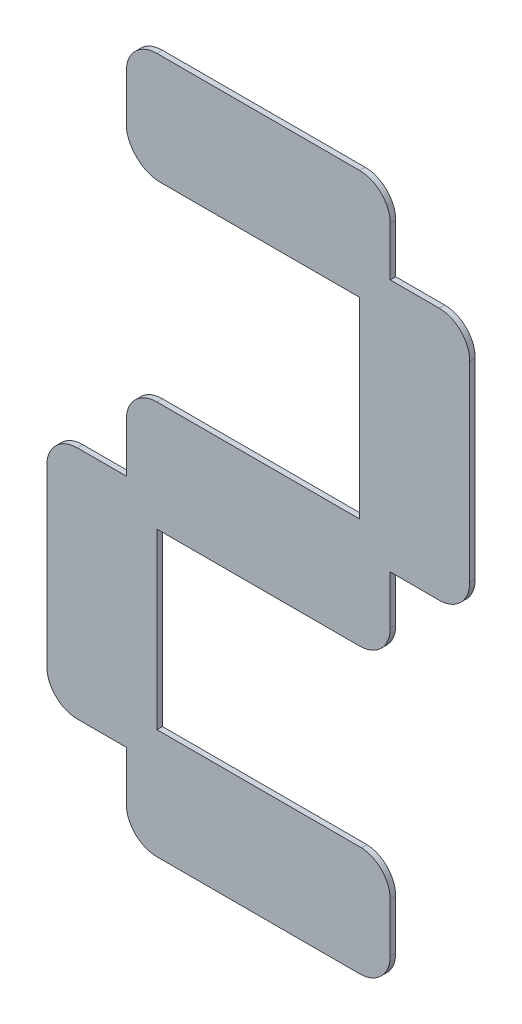
ISO-10303-21;
HEADER;
FILE_DESCRIPTION(('STEP AP214'),'2;1');
FILE_NAME('part.step','',(''),(''),'','','');
FILE_SCHEMA(('AUTOMOTIVE_DESIGN { 1 0 10303 214 1 1 1 1 }'));
ENDSEC;
DATA;
#1=APPLICATION_CONTEXT('core data for automotive mechanical design processes');
#2=APPLICATION_PROTOCOL_DEFINITION('international standard','automotive_design',2000,#1);
#3=PRODUCT_CONTEXT('',#1,'mechanical');
#4=PRODUCT('Part','Part','',(#3));
#5=PRODUCT_RELATED_PRODUCT_CATEGORY('part','',(#4));
#6=PRODUCT_DEFINITION_FORMATION('','',#4);
#7=PRODUCT_DEFINITION_CONTEXT('part definition',#1,'design');
#8=PRODUCT_DEFINITION('design','',#6,#7);
#9=PRODUCT_DEFINITION_SHAPE('','',#8);
#10=(LENGTH_UNIT() NAMED_UNIT(*) SI_UNIT(.MILLI.,.METRE.));
#11=(NAMED_UNIT(*) PLANE_ANGLE_UNIT() SI_UNIT($,.RADIAN.));
#12=(NAMED_UNIT(*) SI_UNIT($,.STERADIAN.) SOLID_ANGLE_UNIT());
#13=UNCERTAINTY_MEASURE_WITH_UNIT(LENGTH_MEASURE(1.E-05),#10,'distance_accuracy_value','');
#14=(GEOMETRIC_REPRESENTATION_CONTEXT(3) GLOBAL_UNCERTAINTY_ASSIGNED_CONTEXT((#13)) GLOBAL_UNIT_ASSIGNED_CONTEXT((#10,
#11,#12)) REPRESENTATION_CONTEXT('',''));
#15=CARTESIAN_POINT('',(0.,0.,0.));
#16=DIRECTION('',(0.,0.,1.));
#17=DIRECTION('',(1.,0.,0.));
#18=AXIS2_PLACEMENT_3D('',#15,#16,#17);
#19=CARTESIAN_POINT('',(8.329409215099,-32.65418459768,0.01));
#20=DIRECTION('',(0.,0.,1.));
#21=DIRECTION('',(1.,0.,0.));
#22=AXIS2_PLACEMENT_3D('',#19,#20,#21);
#23=PLANE('',#22);
#24=CARTESIAN_POINT('',(8.653180193375,-32.22062773011,0.01));
#25=DIRECTION('',(0.,0.,1.));
#26=DIRECTION('',(1.,0.,0.));
#27=AXIS2_PLACEMENT_3D('',#24,#25,#26);
#28=CIRCLE('',#27,0.05530104210836);
#29=CARTESIAN_POINT('',(8.708481235483,-32.22062773011,0.01));
#30=VERTEX_POINT('',#29);
#31=CARTESIAN_POINT('',(8.653180193375,-32.16532668801,0.01));
#32=VERTEX_POINT('',#31);
#33=EDGE_CURVE('E174',#30,#32,#28,.T.);
#34=ORIENTED_EDGE('',*,*,#33,.T.);
#35=DIRECTION('',(1.,0.,0.));
#36=VECTOR('',#35,1.);
#37=CARTESIAN_POINT('',(8.564607569204,-32.16532668801,0.01));
#38=LINE('',#37,#36);
#39=CARTESIAN_POINT('',(8.564607569204,-32.16532668801,0.01));
#40=VERTEX_POINT('',#39);
#41=EDGE_CURVE('E196',#40,#32,#38,.T.);
#42=ORIENTED_EDGE('',*,*,#41,.F.);
#43=DIRECTION('',(0.,-1.,0.));
#44=VECTOR('',#43,1.);
#45=CARTESIAN_POINT('',(8.564607569204,-32.07675406384,0.01));
#46=LINE('',#45,#44);
#47=CARTESIAN_POINT('',(8.564607569204,-32.07675406384,0.01));
#48=VERTEX_POINT('',#47);
#49=EDGE_CURVE('E235',#48,#40,#46,.T.);
#50=ORIENTED_EDGE('',*,*,#49,.F.);
#51=CARTESIAN_POINT('',(8.509306527096,-32.07675406384,0.01));
#52=DIRECTION('',(0.,0.,1.));
#53=DIRECTION('',(1.,0.,0.));
#54=AXIS2_PLACEMENT_3D('',#51,#52,#53);
#55=CIRCLE('',#54,0.05530104210836);
#56=CARTESIAN_POINT('',(8.509306527096,-32.02145302173,0.01));
#57=VERTEX_POINT('',#56);
#58=EDGE_CURVE('E242',#48,#57,#55,.T.);
#59=ORIENTED_EDGE('',*,*,#58,.T.);
#60=DIRECTION('',(1.,0.,0.));
#61=VECTOR('',#60,1.);
#62=CARTESIAN_POINT('',(8.142401846551,-32.02145302173,0.01));
#63=LINE('',#62,#61);
#64=CARTESIAN_POINT('',(8.142401846551,-32.02145302173,0.01));
#65=VERTEX_POINT('',#64);
#66=EDGE_CURVE('E267',#65,#57,#63,.T.);
#67=ORIENTED_EDGE('',*,*,#66,.F.);
#68=CARTESIAN_POINT('',(8.142401846551,-32.07675406384,0.01));
#69=DIRECTION('',(0.,0.,1.));
#70=DIRECTION('',(1.,0.,0.));
#71=AXIS2_PLACEMENT_3D('',#68,#69,#70);
#72=CIRCLE('',#71,0.05530104210836);
#73=CARTESIAN_POINT('',(8.087100804442,-32.07675406384,0.01));
#74=VERTEX_POINT('',#73);
#75=EDGE_CURVE('E280',#65,#74,#72,.T.);
#76=ORIENTED_EDGE('',*,*,#75,.T.);
#77=DIRECTION('',(0.,1.,0.));
#78=VECTOR('',#77,1.);
#79=CARTESIAN_POINT('',(8.087100804442,-32.16532668801,0.01));
#80=LINE('',#79,#78);
#81=CARTESIAN_POINT('',(8.087100804442,-32.16532668801,0.01));
#82=VERTEX_POINT('',#81);
#83=EDGE_CURVE('E164',#82,#74,#80,.T.);
#84=ORIENTED_EDGE('',*,*,#83,.F.);
#85=CARTESIAN_POINT('',(8.150242664368,-32.15698872512,0.01));
#86=DIRECTION('',(0.,0.,1.));
#87=DIRECTION('',(1.,0.,0.));
#88=AXIS2_PLACEMENT_3D('',#85,#86,#87);
#89=CIRCLE('',#88,0.06369);
#90=CARTESIAN_POINT('',(8.144195081973,-32.22039095574,0.01));
#91=VERTEX_POINT('',#90);
#92=EDGE_CURVE('E305',#82,#91,#89,.T.);
#93=ORIENTED_EDGE('',*,*,#92,.T.);
#94=DIRECTION('',(-1.,0.,0.));
#95=VECTOR('',#94,1.);
#96=CARTESIAN_POINT('',(8.509306527096,-32.22039095574,0.01));
#97=LINE('',#96,#95);
#98=CARTESIAN_POINT('',(8.509306527096,-32.22039095574,0.01));
#99=VERTEX_POINT('',#98);
#100=EDGE_CURVE('E312',#99,#91,#97,.T.);
#101=ORIENTED_EDGE('',*,*,#100,.F.);
#102=DIRECTION('',(0.,1.,0.));
#103=VECTOR('',#102,1.);
#104=CARTESIAN_POINT('',(8.509306527096,-32.567618,0.01));
#105=LINE('',#104,#103);
#106=CARTESIAN_POINT('',(8.509306527096,-32.567618,0.01));
#107=VERTEX_POINT('',#106);
#108=EDGE_CURVE('E159',#107,#99,#105,.T.);
#109=ORIENTED_EDGE('',*,*,#108,.F.);
#110=DIRECTION('',(1.,0.,0.));
#111=VECTOR('',#110,1.);
#112=CARTESIAN_POINT('',(8.142401846551,-32.567618,0.01));
#113=LINE('',#112,#111);
#114=CARTESIAN_POINT('',(8.142401846551,-32.567618,0.01));
#115=VERTEX_POINT('',#114);
#116=EDGE_CURVE('E157',#115,#107,#113,.T.);
#117=ORIENTED_EDGE('',*,*,#116,.F.);
#118=CARTESIAN_POINT('',(8.142401845466,-32.622919,0.01));
#119=DIRECTION('',(0.,0.,1.));
#120=DIRECTION('',(1.,0.,0.));
#121=AXIS2_PLACEMENT_3D('',#118,#119,#120);
#122=CIRCLE('',#121,0.055301);
#123=CARTESIAN_POINT('',(8.087100845466,-32.622919,0.01));
#124=VERTEX_POINT('',#123);
#125=EDGE_CURVE('E334',#115,#124,#122,.T.);
#126=ORIENTED_EDGE('',*,*,#125,.T.);
#127=DIRECTION('',(0.,1.,0.));
#128=VECTOR('',#127,1.);
#129=CARTESIAN_POINT('',(8.087100845466,-32.71149166627,0.01));
#130=LINE('',#129,#128);
#131=CARTESIAN_POINT('',(8.087100845466,-32.71149166627,0.01));
#132=VERTEX_POINT('',#131);
#133=EDGE_CURVE('E362',#132,#124,#130,.T.);
#134=ORIENTED_EDGE('',*,*,#133,.F.);
#135=DIRECTION('',(1.,0.,0.));
#136=VECTOR('',#135,1.);
#137=CARTESIAN_POINT('',(7.998528180273,-32.71149166627,0.01));
#138=LINE('',#137,#136);
#139=CARTESIAN_POINT('',(7.998528180273,-32.71149166627,0.01));
#140=VERTEX_POINT('',#139);
#141=EDGE_CURVE('E258',#140,#132,#138,.T.);
#142=ORIENTED_EDGE('',*,*,#141,.F.);
#143=CARTESIAN_POINT('',(7.998528180273,-32.76679270838,0.01));
#144=DIRECTION('',(0.,0.,1.));
#145=DIRECTION('',(1.,0.,0.));
#146=AXIS2_PLACEMENT_3D('',#143,#144,#145);
#147=CIRCLE('',#146,0.05530104210836);
#148=CARTESIAN_POINT('',(7.943227138164,-32.76679270838,0.01));
#149=VERTEX_POINT('',#148);
#150=EDGE_CURVE('E183',#140,#149,#147,.T.);
#151=ORIENTED_EDGE('',*,*,#150,.T.);
#152=DIRECTION('',(0.,1.,0.));
#153=VECTOR('',#152,1.);
#154=CARTESIAN_POINT('',(7.943227138164,-33.08113472498,0.01));
#155=LINE('',#154,#153);
#156=CARTESIAN_POINT('',(7.943227138164,-33.08113472498,0.01));
#157=VERTEX_POINT('',#156);
#158=EDGE_CURVE('E182',#157,#149,#155,.T.);
#159=ORIENTED_EDGE('',*,*,#158,.F.);
#160=CARTESIAN_POINT('',(7.998528180272,-33.08113472498,0.01));
#161=DIRECTION('',(0.,0.,1.));
#162=DIRECTION('',(1.,0.,0.));
#163=AXIS2_PLACEMENT_3D('',#160,#161,#162);
#164=CIRCLE('',#163,0.05530104210772);
#165=CARTESIAN_POINT('',(7.998528180272,-33.13643576709,0.01));
#166=VERTEX_POINT('',#165);
#167=EDGE_CURVE('E253',#157,#166,#164,.T.);
#168=ORIENTED_EDGE('',*,*,#167,.T.);
#169=DIRECTION('',(-1.,0.,0.));
#170=VECTOR('',#169,1.);
#171=CARTESIAN_POINT('',(8.087100804442,-33.13643576709,0.01));
#172=LINE('',#171,#170);
#173=CARTESIAN_POINT('',(8.087100804442,-33.13643576709,0.01));
#174=VERTEX_POINT('',#173);
#175=EDGE_CURVE('E187',#174,#166,#172,.T.);
#176=ORIENTED_EDGE('',*,*,#175,.F.);
#177=DIRECTION('',(0.,1.,0.));
#178=VECTOR('',#177,1.);
#179=CARTESIAN_POINT('',(8.087100804442,-33.22500839126,0.01));
#180=LINE('',#179,#178);
#181=CARTESIAN_POINT('',(8.087100804442,-33.22500839126,0.01));
#182=VERTEX_POINT('',#181);
#183=EDGE_CURVE('E426',#182,#174,#180,.T.);
#184=ORIENTED_EDGE('',*,*,#183,.F.);
#185=CARTESIAN_POINT('',(8.14240184655,-33.22500839126,0.01));
#186=DIRECTION('',(0.,0.,1.));
#187=DIRECTION('',(1.,0.,0.));
#188=AXIS2_PLACEMENT_3D('',#185,#186,#187);
#189=CIRCLE('',#188,0.05530104210772);
#190=CARTESIAN_POINT('',(8.14240184655,-33.28030943337,0.01));
#191=VERTEX_POINT('',#190);
#192=EDGE_CURVE('E442',#182,#191,#189,.T.);
#193=ORIENTED_EDGE('',*,*,#192,.T.);
#194=DIRECTION('',(-1.,0.,0.));
#195=VECTOR('',#194,1.);
#196=CARTESIAN_POINT('',(8.509306527097,-33.28030943337,0.01));
#197=LINE('',#196,#195);
#198=CARTESIAN_POINT('',(8.509306527097,-33.28030943337,0.01));
#199=VERTEX_POINT('',#198);
#200=EDGE_CURVE('E395',#199,#191,#197,.T.);
#201=ORIENTED_EDGE('',*,*,#200,.F.);
#202=CARTESIAN_POINT('',(8.509306527097,-33.22500839126,0.01));
#203=DIRECTION('',(0.,0.,1.));
#204=DIRECTION('',(1.,0.,0.));
#205=AXIS2_PLACEMENT_3D('',#202,#203,#204);
#206=CIRCLE('',#205,0.05530104210772);
#207=CARTESIAN_POINT('',(8.564607569204,-33.22500839126,0.01));
#208=VERTEX_POINT('',#207);
#209=EDGE_CURVE('E208',#199,#208,#206,.T.);
#210=ORIENTED_EDGE('',*,*,#209,.T.);
#211=DIRECTION('',(0.,-1.,0.));
#212=VECTOR('',#211,1.);
#213=CARTESIAN_POINT('',(8.564607569204,-33.13639743733,0.01));
#214=LINE('',#213,#212);
#215=CARTESIAN_POINT('',(8.564607569204,-33.13639743733,0.01));
#216=VERTEX_POINT('',#215);
#217=EDGE_CURVE('E207',#216,#208,#214,.T.);
#218=ORIENTED_EDGE('',*,*,#217,.F.);
#219=CARTESIAN_POINT('',(8.509866829001,-33.13580002791,0.01));
#220=DIRECTION('',(0.,0.,1.));
#221=DIRECTION('',(1.,0.,0.));
#222=AXIS2_PLACEMENT_3D('',#219,#220,#221);
#223=CIRCLE('',#222,0.05474400000015);
#224=CARTESIAN_POINT('',(8.512801141755,-33.08113472498,0.01));
#225=VERTEX_POINT('',#224);
#226=EDGE_CURVE('E325',#216,#225,#223,.T.);
#227=ORIENTED_EDGE('',*,*,#226,.T.);
#228=DIRECTION('',(1.,0.,0.));
#229=VECTOR('',#228,1.);
#230=CARTESIAN_POINT('',(8.142401846551,-33.08113472498,0.01));
#231=LINE('',#230,#229);
#232=CARTESIAN_POINT('',(8.142401846551,-33.08113472498,0.01));
#233=VERTEX_POINT('',#232);
#234=EDGE_CURVE('E464',#233,#225,#231,.T.);
#235=ORIENTED_EDGE('',*,*,#234,.F.);
#236=DIRECTION('',(0.,-1.,0.));
#237=VECTOR('',#236,1.);
#238=CARTESIAN_POINT('',(8.142401846551,-32.7667925692,0.01));
#239=LINE('',#238,#237);
#240=CARTESIAN_POINT('',(8.142401846551,-32.7667925692,0.01));
#241=VERTEX_POINT('',#240);
#242=EDGE_CURVE('E230',#241,#233,#239,.T.);
#243=ORIENTED_EDGE('',*,*,#242,.F.);
#244=DIRECTION('',(-1.,0.,0.));
#245=VECTOR('',#244,1.);
#246=CARTESIAN_POINT('',(8.509306684351,-32.7667925692,0.01));
#247=LINE('',#246,#245);
#248=CARTESIAN_POINT('',(8.509306684351,-32.7667925692,0.01));
#249=VERTEX_POINT('',#248);
#250=EDGE_CURVE('E314',#249,#241,#247,.T.);
#251=ORIENTED_EDGE('',*,*,#250,.F.);
#252=CARTESIAN_POINT('',(8.509306666279,-32.71149166627,0.01));
#253=DIRECTION('',(0.,0.,1.));
#254=DIRECTION('',(1.,0.,0.));
#255=AXIS2_PLACEMENT_3D('',#252,#253,#254);
#256=CIRCLE('',#255,0.05530090292483);
#257=CARTESIAN_POINT('',(8.564607569204,-32.71149166627,0.01));
#258=VERTEX_POINT('',#257);
#259=EDGE_CURVE('E217',#249,#258,#256,.T.);
#260=ORIENTED_EDGE('',*,*,#259,.T.);
#261=DIRECTION('',(0.,-1.,0.));
#262=VECTOR('',#261,1.);
#263=CARTESIAN_POINT('',(8.564607569204,-32.6229190421,0.01));
#264=LINE('',#263,#262);
#265=CARTESIAN_POINT('',(8.564607569204,-32.6229190421,0.01));
#266=VERTEX_POINT('',#265);
#267=EDGE_CURVE('E131',#266,#258,#264,.T.);
#268=ORIENTED_EDGE('',*,*,#267,.F.);
#269=DIRECTION('',(-1.,0.,0.));
#270=VECTOR('',#269,1.);
#271=CARTESIAN_POINT('',(8.653180193375,-32.6229190421,0.01));
#272=LINE('',#271,#270);
#273=CARTESIAN_POINT('',(8.653180193375,-32.6229190421,0.01));
#274=VERTEX_POINT('',#273);
#275=EDGE_CURVE('E128',#274,#266,#272,.T.);
#276=ORIENTED_EDGE('',*,*,#275,.F.);
#277=CARTESIAN_POINT('',(8.653180193375,-32.567618,0.01));
#278=DIRECTION('',(0.,0.,1.));
#279=DIRECTION('',(1.,0.,0.));
#280=AXIS2_PLACEMENT_3D('',#277,#278,#279);
#281=CIRCLE('',#280,0.05530104210836);
#282=CARTESIAN_POINT('',(8.708481235483,-32.567618,0.01));
#283=VERTEX_POINT('',#282);
#284=EDGE_CURVE('E20',#274,#283,#281,.T.);
#285=ORIENTED_EDGE('',*,*,#284,.T.);
#286=DIRECTION('',(0.,-1.,0.));
#287=VECTOR('',#286,1.);
#288=CARTESIAN_POINT('',(8.708481235483,-32.22062773011,0.01));
#289=LINE('',#288,#287);
#290=EDGE_CURVE('E27',#30,#283,#289,.T.);
#291=ORIENTED_EDGE('',*,*,#290,.F.);
#292=EDGE_LOOP('',(#34,#42,#50,#59,#67,#76,#84,#93,#101,#109,#117,#126,#134,#142,#151,#159,#168,
#176,#184,#193,#201,#210,#218,#227,#235,#243,#251,#260,#268,#276,#285,#291));
#293=FACE_BOUND('',#292,.T.);
#294=ADVANCED_FACE('F17',(#293),#23,.T.);
#295=CARTESIAN_POINT('',(8.329409215099,-32.65418459768,0.));
#296=DIRECTION('',(0.,0.,1.));
#297=DIRECTION('',(1.,0.,0.));
#298=AXIS2_PLACEMENT_3D('',#295,#296,#297);
#299=PLANE('',#298);
#300=CARTESIAN_POINT('',(8.653180193375,-32.22062773011,0.));
#301=DIRECTION('',(0.,0.,1.));
#302=DIRECTION('',(1.,0.,0.));
#303=AXIS2_PLACEMENT_3D('',#300,#301,#302);
#304=CIRCLE('',#303,0.05530104210836);
#305=CARTESIAN_POINT('',(8.708481235483,-32.22062773011,0.));
#306=VERTEX_POINT('',#305);
#307=CARTESIAN_POINT('',(8.653180193375,-32.16532668801,0.));
#308=VERTEX_POINT('',#307);
#309=EDGE_CURVE('E152',#306,#308,#304,.T.);
#310=ORIENTED_EDGE('',*,*,#309,.F.);
#311=DIRECTION('',(0.,-1.,0.));
#312=VECTOR('',#311,1.);
#313=CARTESIAN_POINT('',(8.708481235483,-32.22062773011,0.));
#314=LINE('',#313,#312);
#315=CARTESIAN_POINT('',(8.708481235483,-32.567618,0.));
#316=VERTEX_POINT('',#315);
#317=EDGE_CURVE('E11',#306,#316,#314,.T.);
#318=ORIENTED_EDGE('',*,*,#317,.T.);
#319=CARTESIAN_POINT('',(8.653180193375,-32.567618,0.));
#320=DIRECTION('',(0.,0.,1.));
#321=DIRECTION('',(1.,0.,0.));
#322=AXIS2_PLACEMENT_3D('',#319,#320,#321);
#323=CIRCLE('',#322,0.05530104210836);
#324=CARTESIAN_POINT('',(8.653180193375,-32.6229190421,0.));
#325=VERTEX_POINT('',#324);
#326=EDGE_CURVE('E268',#325,#316,#323,.T.);
#327=ORIENTED_EDGE('',*,*,#326,.F.);
#328=DIRECTION('',(-1.,0.,0.));
#329=VECTOR('',#328,1.);
#330=CARTESIAN_POINT('',(8.653180193375,-32.6229190421,0.));
#331=LINE('',#330,#329);
#332=CARTESIAN_POINT('',(8.564607569204,-32.6229190421,0.));
#333=VERTEX_POINT('',#332);
#334=EDGE_CURVE('E136',#325,#333,#331,.T.);
#335=ORIENTED_EDGE('',*,*,#334,.T.);
#336=DIRECTION('',(0.,-1.,0.));
#337=VECTOR('',#336,1.);
#338=CARTESIAN_POINT('',(8.564607569204,-32.6229190421,0.));
#339=LINE('',#338,#337);
#340=CARTESIAN_POINT('',(8.564607569204,-32.71149166627,0.));
#341=VERTEX_POINT('',#340);
#342=EDGE_CURVE('E140',#333,#341,#339,.T.);
#343=ORIENTED_EDGE('',*,*,#342,.T.);
#344=CARTESIAN_POINT('',(8.509306666279,-32.71149166627,0.));
#345=DIRECTION('',(0.,0.,1.));
#346=DIRECTION('',(1.,0.,0.));
#347=AXIS2_PLACEMENT_3D('',#344,#345,#346);
#348=CIRCLE('',#347,0.05530090292483);
#349=CARTESIAN_POINT('',(8.509306684351,-32.7667925692,0.));
#350=VERTEX_POINT('',#349);
#351=EDGE_CURVE('E197',#350,#341,#348,.T.);
#352=ORIENTED_EDGE('',*,*,#351,.F.);
#353=DIRECTION('',(-1.,0.,0.));
#354=VECTOR('',#353,1.);
#355=CARTESIAN_POINT('',(8.509306684351,-32.7667925692,0.));
#356=LINE('',#355,#354);
#357=CARTESIAN_POINT('',(8.142401846551,-32.7667925692,0.));
#358=VERTEX_POINT('',#357);
#359=EDGE_CURVE('E202',#350,#358,#356,.T.);
#360=ORIENTED_EDGE('',*,*,#359,.T.);
#361=DIRECTION('',(0.,-1.,0.));
#362=VECTOR('',#361,1.);
#363=CARTESIAN_POINT('',(8.142401846551,-32.7667925692,0.));
#364=LINE('',#363,#362);
#365=CARTESIAN_POINT('',(8.142401846551,-33.08113472498,0.));
#366=VERTEX_POINT('',#365);
#367=EDGE_CURVE('E389',#358,#366,#364,.T.);
#368=ORIENTED_EDGE('',*,*,#367,.T.);
#369=DIRECTION('',(1.,0.,0.));
#370=VECTOR('',#369,1.);
#371=CARTESIAN_POINT('',(8.142401846551,-33.08113472498,0.));
#372=LINE('',#371,#370);
#373=CARTESIAN_POINT('',(8.512801141755,-33.08113472498,0.));
#374=VERTEX_POINT('',#373);
#375=EDGE_CURVE('E231',#366,#374,#372,.T.);
#376=ORIENTED_EDGE('',*,*,#375,.T.);
#377=CARTESIAN_POINT('',(8.509866829001,-33.13580002791,0.));
#378=DIRECTION('',(0.,0.,1.));
#379=DIRECTION('',(1.,0.,0.));
#380=AXIS2_PLACEMENT_3D('',#377,#378,#379);
#381=CIRCLE('',#380,0.05474400000015);
#382=CARTESIAN_POINT('',(8.564607569204,-33.13639743733,0.));
#383=VERTEX_POINT('',#382);
#384=EDGE_CURVE('E287',#383,#374,#381,.T.);
#385=ORIENTED_EDGE('',*,*,#384,.F.);
#386=DIRECTION('',(0.,-1.,0.));
#387=VECTOR('',#386,1.);
#388=CARTESIAN_POINT('',(8.564607569204,-33.13639743733,0.));
#389=LINE('',#388,#387);
#390=CARTESIAN_POINT('',(8.564607569204,-33.22500839126,0.));
#391=VERTEX_POINT('',#390);
#392=EDGE_CURVE('E284',#383,#391,#389,.T.);
#393=ORIENTED_EDGE('',*,*,#392,.T.);
#394=CARTESIAN_POINT('',(8.509306527097,-33.22500839126,0.));
#395=DIRECTION('',(0.,0.,1.));
#396=DIRECTION('',(1.,0.,0.));
#397=AXIS2_PLACEMENT_3D('',#394,#395,#396);
#398=CIRCLE('',#397,0.05530104210772);
#399=CARTESIAN_POINT('',(8.509306527097,-33.28030943337,0.));
#400=VERTEX_POINT('',#399);
#401=EDGE_CURVE('E394',#400,#391,#398,.T.);
#402=ORIENTED_EDGE('',*,*,#401,.F.);
#403=DIRECTION('',(-1.,0.,0.));
#404=VECTOR('',#403,1.);
#405=CARTESIAN_POINT('',(8.509306527097,-33.28030943337,0.));
#406=LINE('',#405,#404);
#407=CARTESIAN_POINT('',(8.14240184655,-33.28030943337,0.));
#408=VERTEX_POINT('',#407);
#409=EDGE_CURVE('E390',#400,#408,#406,.T.);
#410=ORIENTED_EDGE('',*,*,#409,.T.);
#411=CARTESIAN_POINT('',(8.14240184655,-33.22500839126,0.));
#412=DIRECTION('',(0.,0.,1.));
#413=DIRECTION('',(1.,0.,0.));
#414=AXIS2_PLACEMENT_3D('',#411,#412,#413);
#415=CIRCLE('',#414,0.05530104210772);
#416=CARTESIAN_POINT('',(8.087100804442,-33.22500839126,0.));
#417=VERTEX_POINT('',#416);
#418=EDGE_CURVE('E434',#417,#408,#415,.T.);
#419=ORIENTED_EDGE('',*,*,#418,.F.);
#420=DIRECTION('',(0.,1.,0.));
#421=VECTOR('',#420,1.);
#422=CARTESIAN_POINT('',(8.087100804442,-33.22500839126,0.));
#423=LINE('',#422,#421);
#424=CARTESIAN_POINT('',(8.087100804442,-33.13643576709,0.));
#425=VERTEX_POINT('',#424);
#426=EDGE_CURVE('E430',#417,#425,#423,.T.);
#427=ORIENTED_EDGE('',*,*,#426,.T.);
#428=DIRECTION('',(-1.,0.,0.));
#429=VECTOR('',#428,1.);
#430=CARTESIAN_POINT('',(8.087100804442,-33.13643576709,0.));
#431=LINE('',#430,#429);
#432=CARTESIAN_POINT('',(7.998528180272,-33.13643576709,0.));
#433=VERTEX_POINT('',#432);
#434=EDGE_CURVE('E191',#425,#433,#431,.T.);
#435=ORIENTED_EDGE('',*,*,#434,.T.);
#436=CARTESIAN_POINT('',(7.998528180272,-33.08113472498,0.));
#437=DIRECTION('',(0.,0.,1.));
#438=DIRECTION('',(1.,0.,0.));
#439=AXIS2_PLACEMENT_3D('',#436,#437,#438);
#440=CIRCLE('',#439,0.05530104210772);
#441=CARTESIAN_POINT('',(7.943227138164,-33.08113472498,0.));
#442=VERTEX_POINT('',#441);
#443=EDGE_CURVE('E409',#442,#433,#440,.T.);
#444=ORIENTED_EDGE('',*,*,#443,.F.);
#445=DIRECTION('',(0.,1.,0.));
#446=VECTOR('',#445,1.);
#447=CARTESIAN_POINT('',(7.943227138164,-33.08113472498,0.));
#448=LINE('',#447,#446);
#449=CARTESIAN_POINT('',(7.943227138164,-32.76679270838,0.));
#450=VERTEX_POINT('',#449);
#451=EDGE_CURVE('E405',#442,#450,#448,.T.);
#452=ORIENTED_EDGE('',*,*,#451,.T.);
#453=CARTESIAN_POINT('',(7.998528180273,-32.76679270838,0.));
#454=DIRECTION('',(0.,0.,1.));
#455=DIRECTION('',(1.,0.,0.));
#456=AXIS2_PLACEMENT_3D('',#453,#454,#455);
#457=CIRCLE('',#456,0.05530104210836);
#458=CARTESIAN_POINT('',(7.998528180273,-32.71149166627,0.));
#459=VERTEX_POINT('',#458);
#460=EDGE_CURVE('E379',#459,#450,#457,.T.);
#461=ORIENTED_EDGE('',*,*,#460,.F.);
#462=DIRECTION('',(1.,0.,0.));
#463=VECTOR('',#462,1.);
#464=CARTESIAN_POINT('',(7.998528180273,-32.71149166627,0.));
#465=LINE('',#464,#463);
#466=CARTESIAN_POINT('',(8.087100845466,-32.71149166627,0.));
#467=VERTEX_POINT('',#466);
#468=EDGE_CURVE('E262',#459,#467,#465,.T.);
#469=ORIENTED_EDGE('',*,*,#468,.T.);
#470=DIRECTION('',(0.,1.,0.));
#471=VECTOR('',#470,1.);
#472=CARTESIAN_POINT('',(8.087100845466,-32.71149166627,0.));
#473=LINE('',#472,#471);
#474=CARTESIAN_POINT('',(8.087100845466,-32.622919,0.));
#475=VERTEX_POINT('',#474);
#476=EDGE_CURVE('E369',#467,#475,#473,.T.);
#477=ORIENTED_EDGE('',*,*,#476,.T.);
#478=CARTESIAN_POINT('',(8.142401845466,-32.622919,0.));
#479=DIRECTION('',(0.,0.,1.));
#480=DIRECTION('',(1.,0.,0.));
#481=AXIS2_PLACEMENT_3D('',#478,#479,#480);
#482=CIRCLE('',#481,0.055301);
#483=CARTESIAN_POINT('',(8.142401846551,-32.567618,0.));
#484=VERTEX_POINT('',#483);
#485=EDGE_CURVE('E350',#484,#475,#482,.T.);
#486=ORIENTED_EDGE('',*,*,#485,.F.);
#487=DIRECTION('',(1.,0.,0.));
#488=VECTOR('',#487,1.);
#489=CARTESIAN_POINT('',(8.142401846551,-32.567618,0.));
#490=LINE('',#489,#488);
#491=CARTESIAN_POINT('',(8.509306527096,-32.567618,0.));
#492=VERTEX_POINT('',#491);
#493=EDGE_CURVE('E346',#484,#492,#490,.T.);
#494=ORIENTED_EDGE('',*,*,#493,.T.);
#495=DIRECTION('',(0.,1.,0.));
#496=VECTOR('',#495,1.);
#497=CARTESIAN_POINT('',(8.509306527096,-32.567618,0.));
#498=LINE('',#497,#496);
#499=CARTESIAN_POINT('',(8.509306527096,-32.22039095574,0.));
#500=VERTEX_POINT('',#499);
#501=EDGE_CURVE('E158',#492,#500,#498,.T.);
#502=ORIENTED_EDGE('',*,*,#501,.T.);
#503=DIRECTION('',(-1.,0.,0.));
#504=VECTOR('',#503,1.);
#505=CARTESIAN_POINT('',(8.509306527096,-32.22039095574,0.));
#506=LINE('',#505,#504);
#507=CARTESIAN_POINT('',(8.144195081973,-32.22039095574,0.));
#508=VERTEX_POINT('',#507);
#509=EDGE_CURVE('E321',#500,#508,#506,.T.);
#510=ORIENTED_EDGE('',*,*,#509,.T.);
#511=CARTESIAN_POINT('',(8.150242664368,-32.15698872512,0.));
#512=DIRECTION('',(0.,0.,1.));
#513=DIRECTION('',(1.,0.,0.));
#514=AXIS2_PLACEMENT_3D('',#511,#512,#513);
#515=CIRCLE('',#514,0.06369);
#516=CARTESIAN_POINT('',(8.087100804442,-32.16532668801,0.));
#517=VERTEX_POINT('',#516);
#518=EDGE_CURVE('E297',#517,#508,#515,.T.);
#519=ORIENTED_EDGE('',*,*,#518,.F.);
#520=DIRECTION('',(0.,1.,0.));
#521=VECTOR('',#520,1.);
#522=CARTESIAN_POINT('',(8.087100804442,-32.16532668801,0.));
#523=LINE('',#522,#521);
#524=CARTESIAN_POINT('',(8.087100804442,-32.07675406384,0.));
#525=VERTEX_POINT('',#524);
#526=EDGE_CURVE('E168',#517,#525,#523,.T.);
#527=ORIENTED_EDGE('',*,*,#526,.T.);
#528=CARTESIAN_POINT('',(8.142401846551,-32.07675406384,0.));
#529=DIRECTION('',(0.,0.,1.));
#530=DIRECTION('',(1.,0.,0.));
#531=AXIS2_PLACEMENT_3D('',#528,#529,#530);
#532=CIRCLE('',#531,0.05530104210836);
#533=CARTESIAN_POINT('',(8.142401846551,-32.02145302173,0.));
#534=VERTEX_POINT('',#533);
#535=EDGE_CURVE('E243',#534,#525,#532,.T.);
#536=ORIENTED_EDGE('',*,*,#535,.F.);
#537=DIRECTION('',(1.,0.,0.));
#538=VECTOR('',#537,1.);
#539=CARTESIAN_POINT('',(8.142401846551,-32.02145302173,0.));
#540=LINE('',#539,#538);
#541=CARTESIAN_POINT('',(8.509306527096,-32.02145302173,0.));
#542=VERTEX_POINT('',#541);
#543=EDGE_CURVE('E248',#534,#542,#540,.T.);
#544=ORIENTED_EDGE('',*,*,#543,.T.);
#545=CARTESIAN_POINT('',(8.509306527096,-32.07675406384,0.));
#546=DIRECTION('',(0.,0.,1.));
#547=DIRECTION('',(1.,0.,0.));
#548=AXIS2_PLACEMENT_3D('',#545,#546,#547);
#549=CIRCLE('',#548,0.05530104210836);
#550=CARTESIAN_POINT('',(8.564607569204,-32.07675406384,0.));
#551=VERTEX_POINT('',#550);
#552=EDGE_CURVE('E221',#551,#542,#549,.T.);
#553=ORIENTED_EDGE('',*,*,#552,.F.);
#554=DIRECTION('',(0.,-1.,0.));
#555=VECTOR('',#554,1.);
#556=CARTESIAN_POINT('',(8.564607569204,-32.07675406384,0.));
#557=LINE('',#556,#555);
#558=CARTESIAN_POINT('',(8.564607569204,-32.16532668801,0.));
#559=VERTEX_POINT('',#558);
#560=EDGE_CURVE('E149',#551,#559,#557,.T.);
#561=ORIENTED_EDGE('',*,*,#560,.T.);
#562=DIRECTION('',(1.,0.,0.));
#563=VECTOR('',#562,1.);
#564=CARTESIAN_POINT('',(8.564607569204,-32.16532668801,0.));
#565=LINE('',#564,#563);
#566=EDGE_CURVE('E212',#559,#308,#565,.T.);
#567=ORIENTED_EDGE('',*,*,#566,.T.);
#568=EDGE_LOOP('',(#310,#318,#327,#335,#343,#352,#360,#368,#376,#385,#393,#402,#410,#419,#427,
#435,#444,#452,#461,#469,#477,#486,#494,#502,#510,#519,#527,#536,#544,#553,#561,#567));
#569=FACE_BOUND('',#568,.T.);
#570=ADVANCED_FACE('F503',(#569),#299,.F.);
#571=CARTESIAN_POINT('',(8.708481235483,-32.22062773011,0.));
#572=DIRECTION('',(1.,0.,0.));
#573=DIRECTION('',(0.,1.,0.));
#574=AXIS2_PLACEMENT_3D('',#571,#572,#573);
#575=PLANE('',#574);
#576=DIRECTION('',(0.,0.,1.));
#577=VECTOR('',#576,1.);
#578=CARTESIAN_POINT('',(8.708481235483,-32.22062773011,0.));
#579=LINE('',#578,#577);
#580=EDGE_CURVE('E150',#306,#30,#579,.T.);
#581=ORIENTED_EDGE('',*,*,#580,.T.);
#582=ORIENTED_EDGE('',*,*,#290,.T.);
#583=DIRECTION('',(0.,0.,1.));
#584=VECTOR('',#583,1.);
#585=CARTESIAN_POINT('',(8.708481235483,-32.567618,0.));
#586=LINE('',#585,#584);
#587=EDGE_CURVE('E124',#316,#283,#586,.T.);
#588=ORIENTED_EDGE('',*,*,#587,.F.);
#589=ORIENTED_EDGE('',*,*,#317,.F.);
#590=EDGE_LOOP('',(#581,#582,#588,#589));
#591=FACE_BOUND('',#590,.T.);
#592=ADVANCED_FACE('F767',(#591),#575,.T.);
#593=CARTESIAN_POINT('',(8.653180193375,-32.567618,0.));
#594=DIRECTION('',(0.,0.,-1.));
#595=DIRECTION('',(1.,0.,0.));
#596=AXIS2_PLACEMENT_3D('',#593,#594,#595);
#597=CYLINDRICAL_SURFACE('',#596,0.05530104210836);
#598=DIRECTION('',(0.,0.,1.));
#599=VECTOR('',#598,1.);
#600=CARTESIAN_POINT('',(8.653180193375,-32.6229190421,0.));
#601=LINE('',#600,#599);
#602=EDGE_CURVE('E123',#325,#274,#601,.T.);
#603=ORIENTED_EDGE('',*,*,#602,.F.);
#604=ORIENTED_EDGE('',*,*,#326,.T.);
#605=ORIENTED_EDGE('',*,*,#587,.T.);
#606=ORIENTED_EDGE('',*,*,#284,.F.);
#607=EDGE_LOOP('',(#603,#604,#605,#606));
#608=FACE_BOUND('',#607,.T.);
#609=ADVANCED_FACE('F120',(#608),#597,.T.);
#610=CARTESIAN_POINT('',(8.653180193375,-32.6229190421,0.));
#611=DIRECTION('',(0.,-1.,0.));
#612=DIRECTION('',(0.,0.,-1.));
#613=AXIS2_PLACEMENT_3D('',#610,#611,#612);
#614=PLANE('',#613);
#615=ORIENTED_EDGE('',*,*,#602,.T.);
#616=ORIENTED_EDGE('',*,*,#275,.T.);
#617=DIRECTION('',(0.,0.,1.));
#618=VECTOR('',#617,1.);
#619=CARTESIAN_POINT('',(8.564607569204,-32.6229190421,0.));
#620=LINE('',#619,#618);
#621=EDGE_CURVE('E220',#333,#266,#620,.T.);
#622=ORIENTED_EDGE('',*,*,#621,.F.);
#623=ORIENTED_EDGE('',*,*,#334,.F.);
#624=EDGE_LOOP('',(#615,#616,#622,#623));
#625=FACE_BOUND('',#624,.T.);
#626=ADVANCED_FACE('F138',(#625),#614,.T.);
#627=CARTESIAN_POINT('',(8.564607569204,-32.6229190421,0.));
#628=DIRECTION('',(1.,0.,0.));
#629=DIRECTION('',(0.,1.,0.));
#630=AXIS2_PLACEMENT_3D('',#627,#628,#629);
#631=PLANE('',#630);
#632=ORIENTED_EDGE('',*,*,#621,.T.);
#633=ORIENTED_EDGE('',*,*,#267,.T.);
#634=DIRECTION('',(0.,0.,1.));
#635=VECTOR('',#634,1.);
#636=CARTESIAN_POINT('',(8.564607569204,-32.71149166627,0.));
#637=LINE('',#636,#635);
#638=EDGE_CURVE('E201',#341,#258,#637,.T.);
#639=ORIENTED_EDGE('',*,*,#638,.F.);
#640=ORIENTED_EDGE('',*,*,#342,.F.);
#641=EDGE_LOOP('',(#632,#633,#639,#640));
#642=FACE_BOUND('',#641,.T.);
#643=ADVANCED_FACE('F492',(#642),#631,.T.);
#644=CARTESIAN_POINT('',(8.509306666279,-32.71149166627,0.));
#645=DIRECTION('',(0.,0.,-1.));
#646=DIRECTION('',(1.,0.,0.));
#647=AXIS2_PLACEMENT_3D('',#644,#645,#646);
#648=CYLINDRICAL_SURFACE('',#647,0.05530090292483);
#649=DIRECTION('',(0.,0.,1.));
#650=VECTOR('',#649,1.);
#651=CARTESIAN_POINT('',(8.509306684351,-32.7667925692,0.));
#652=LINE('',#651,#650);
#653=EDGE_CURVE('E317',#350,#249,#652,.T.);
#654=ORIENTED_EDGE('',*,*,#653,.F.);
#655=ORIENTED_EDGE('',*,*,#351,.T.);
#656=ORIENTED_EDGE('',*,*,#638,.T.);
#657=ORIENTED_EDGE('',*,*,#259,.F.);
#658=EDGE_LOOP('',(#654,#655,#656,#657));
#659=FACE_BOUND('',#658,.T.);
#660=ADVANCED_FACE('F499',(#659),#648,.T.);
#661=CARTESIAN_POINT('',(8.509306684351,-32.7667925692,0.));
#662=DIRECTION('',(0.,-1.,0.));
#663=DIRECTION('',(0.,0.,-1.));
#664=AXIS2_PLACEMENT_3D('',#661,#662,#663);
#665=PLANE('',#664);
#666=ORIENTED_EDGE('',*,*,#653,.T.);
#667=ORIENTED_EDGE('',*,*,#250,.T.);
#668=DIRECTION('',(0.,0.,1.));
#669=VECTOR('',#668,1.);
#670=CARTESIAN_POINT('',(8.142401846551,-32.7667925692,0.));
#671=LINE('',#670,#669);
#672=EDGE_CURVE('E226',#358,#241,#671,.T.);
#673=ORIENTED_EDGE('',*,*,#672,.F.);
#674=ORIENTED_EDGE('',*,*,#359,.F.);
#675=EDGE_LOOP('',(#666,#667,#673,#674));
#676=FACE_BOUND('',#675,.T.);
#677=ADVANCED_FACE('F507',(#676),#665,.T.);
#678=CARTESIAN_POINT('',(8.142401846551,-32.7667925692,0.));
#679=DIRECTION('',(1.,0.,0.));
#680=DIRECTION('',(0.,1.,0.));
#681=AXIS2_PLACEMENT_3D('',#678,#679,#680);
#682=PLANE('',#681);
#683=ORIENTED_EDGE('',*,*,#672,.T.);
#684=ORIENTED_EDGE('',*,*,#242,.T.);
#685=DIRECTION('',(0.,0.,1.));
#686=VECTOR('',#685,1.);
#687=CARTESIAN_POINT('',(8.142401846551,-33.08113472498,0.));
#688=LINE('',#687,#686);
#689=EDGE_CURVE('E329',#366,#233,#688,.T.);
#690=ORIENTED_EDGE('',*,*,#689,.F.);
#691=ORIENTED_EDGE('',*,*,#367,.F.);
#692=EDGE_LOOP('',(#683,#684,#690,#691));
#693=FACE_BOUND('',#692,.T.);
#694=ADVANCED_FACE('F509',(#693),#682,.T.);
#695=CARTESIAN_POINT('',(8.142401846551,-33.08113472498,0.));
#696=DIRECTION('',(0.,1.,0.));
#697=DIRECTION('',(1.,0.,0.));
#698=AXIS2_PLACEMENT_3D('',#695,#696,#697);
#699=PLANE('',#698);
#700=ORIENTED_EDGE('',*,*,#689,.T.);
#701=ORIENTED_EDGE('',*,*,#234,.T.);
#702=DIRECTION('',(0.,0.,1.));
#703=VECTOR('',#702,1.);
#704=CARTESIAN_POINT('',(8.512801141755,-33.08113472498,0.));
#705=LINE('',#704,#703);
#706=EDGE_CURVE('E330',#374,#225,#705,.T.);
#707=ORIENTED_EDGE('',*,*,#706,.F.);
#708=ORIENTED_EDGE('',*,*,#375,.F.);
#709=EDGE_LOOP('',(#700,#701,#707,#708));
#710=FACE_BOUND('',#709,.T.);
#711=ADVANCED_FACE('F517',(#710),#699,.T.);
#712=CARTESIAN_POINT('',(8.509866829001,-33.13580002791,0.));
#713=DIRECTION('',(0.,0.,-1.));
#714=DIRECTION('',(1.,0.,0.));
#715=AXIS2_PLACEMENT_3D('',#712,#713,#714);
#716=CYLINDRICAL_SURFACE('',#715,0.05474400000015);
#717=DIRECTION('',(0.,0.,1.));
#718=VECTOR('',#717,1.);
#719=CARTESIAN_POINT('',(8.564607569204,-33.13639743733,0.));
#720=LINE('',#719,#718);
#721=EDGE_CURVE('E203',#383,#216,#720,.T.);
#722=ORIENTED_EDGE('',*,*,#721,.F.);
#723=ORIENTED_EDGE('',*,*,#384,.T.);
#724=ORIENTED_EDGE('',*,*,#706,.T.);
#725=ORIENTED_EDGE('',*,*,#226,.F.);
#726=EDGE_LOOP('',(#722,#723,#724,#725));
#727=FACE_BOUND('',#726,.T.);
#728=ADVANCED_FACE('F522',(#727),#716,.T.);
#729=CARTESIAN_POINT('',(8.564607569204,-33.13639743733,0.));
#730=DIRECTION('',(1.,0.,0.));
#731=DIRECTION('',(0.,1.,0.));
#732=AXIS2_PLACEMENT_3D('',#729,#730,#731);
#733=PLANE('',#732);
#734=ORIENTED_EDGE('',*,*,#721,.T.);
#735=ORIENTED_EDGE('',*,*,#217,.T.);
#736=DIRECTION('',(0.,0.,1.));
#737=VECTOR('',#736,1.);
#738=CARTESIAN_POINT('',(8.564607569204,-33.22500839126,0.));
#739=LINE('',#738,#737);
#740=EDGE_CURVE('E455',#391,#208,#739,.T.);
#741=ORIENTED_EDGE('',*,*,#740,.F.);
#742=ORIENTED_EDGE('',*,*,#392,.F.);
#743=EDGE_LOOP('',(#734,#735,#741,#742));
#744=FACE_BOUND('',#743,.T.);
#745=ADVANCED_FACE('F526',(#744),#733,.T.);
#746=CARTESIAN_POINT('',(8.509306527097,-33.22500839126,0.));
#747=DIRECTION('',(0.,0.,-1.));
#748=DIRECTION('',(1.,0.,0.));
#749=AXIS2_PLACEMENT_3D('',#746,#747,#748);
#750=CYLINDRICAL_SURFACE('',#749,0.05530104210772);
#751=DIRECTION('',(0.,0.,1.));
#752=VECTOR('',#751,1.);
#753=CARTESIAN_POINT('',(8.509306527097,-33.28030943337,0.));
#754=LINE('',#753,#752);
#755=EDGE_CURVE('E446',#400,#199,#754,.T.);
#756=ORIENTED_EDGE('',*,*,#755,.F.);
#757=ORIENTED_EDGE('',*,*,#401,.T.);
#758=ORIENTED_EDGE('',*,*,#740,.T.);
#759=ORIENTED_EDGE('',*,*,#209,.F.);
#760=EDGE_LOOP('',(#756,#757,#758,#759));
#761=FACE_BOUND('',#760,.T.);
#762=ADVANCED_FACE('F530',(#761),#750,.T.);
#763=CARTESIAN_POINT('',(8.509306527097,-33.28030943337,0.));
#764=DIRECTION('',(0.,-1.,0.));
#765=DIRECTION('',(0.,0.,-1.));
#766=AXIS2_PLACEMENT_3D('',#763,#764,#765);
#767=PLANE('',#766);
#768=ORIENTED_EDGE('',*,*,#755,.T.);
#769=ORIENTED_EDGE('',*,*,#200,.T.);
#770=DIRECTION('',(0.,0.,1.));
#771=VECTOR('',#770,1.);
#772=CARTESIAN_POINT('',(8.14240184655,-33.28030943337,0.));
#773=LINE('',#772,#771);
#774=EDGE_CURVE('E438',#408,#191,#773,.T.);
#775=ORIENTED_EDGE('',*,*,#774,.F.);
#776=ORIENTED_EDGE('',*,*,#409,.F.);
#777=EDGE_LOOP('',(#768,#769,#775,#776));
#778=FACE_BOUND('',#777,.T.);
#779=ADVANCED_FACE('F535',(#778),#767,.T.);
#780=CARTESIAN_POINT('',(8.14240184655,-33.22500839126,0.));
#781=DIRECTION('',(0.,0.,-1.));
#782=DIRECTION('',(1.,0.,0.));
#783=AXIS2_PLACEMENT_3D('',#780,#781,#782);
#784=CYLINDRICAL_SURFACE('',#783,0.05530104210772);
#785=DIRECTION('',(0.,0.,1.));
#786=VECTOR('',#785,1.);
#787=CARTESIAN_POINT('',(8.087100804442,-33.22500839126,0.));
#788=LINE('',#787,#786);
#789=EDGE_CURVE('E422',#417,#182,#788,.T.);
#790=ORIENTED_EDGE('',*,*,#789,.F.);
#791=ORIENTED_EDGE('',*,*,#418,.T.);
#792=ORIENTED_EDGE('',*,*,#774,.T.);
#793=ORIENTED_EDGE('',*,*,#192,.F.);
#794=EDGE_LOOP('',(#790,#791,#792,#793));
#795=FACE_BOUND('',#794,.T.);
#796=ADVANCED_FACE('F541',(#795),#784,.T.);
#797=CARTESIAN_POINT('',(8.087100804442,-33.22500839126,0.));
#798=DIRECTION('',(-1.,0.,0.));
#799=DIRECTION('',(0.,0.,1.));
#800=AXIS2_PLACEMENT_3D('',#797,#798,#799);
#801=PLANE('',#800);
#802=ORIENTED_EDGE('',*,*,#789,.T.);
#803=ORIENTED_EDGE('',*,*,#183,.T.);
#804=DIRECTION('',(0.,0.,1.));
#805=VECTOR('',#804,1.);
#806=CARTESIAN_POINT('',(8.087100804442,-33.13643576709,0.));
#807=LINE('',#806,#805);
#808=EDGE_CURVE('E192',#425,#174,#807,.T.);
#809=ORIENTED_EDGE('',*,*,#808,.F.);
#810=ORIENTED_EDGE('',*,*,#426,.F.);
#811=EDGE_LOOP('',(#802,#803,#809,#810));
#812=FACE_BOUND('',#811,.T.);
#813=ADVANCED_FACE('F551',(#812),#801,.T.);
#814=CARTESIAN_POINT('',(8.087100804442,-33.13643576709,0.));
#815=DIRECTION('',(0.,-1.,0.));
#816=DIRECTION('',(0.,0.,-1.));
#817=AXIS2_PLACEMENT_3D('',#814,#815,#816);
#818=PLANE('',#817);
#819=ORIENTED_EDGE('',*,*,#808,.T.);
#820=ORIENTED_EDGE('',*,*,#175,.T.);
#821=DIRECTION('',(0.,0.,1.));
#822=VECTOR('',#821,1.);
#823=CARTESIAN_POINT('',(7.998528180272,-33.13643576709,0.));
#824=LINE('',#823,#822);
#825=EDGE_CURVE('E257',#433,#166,#824,.T.);
#826=ORIENTED_EDGE('',*,*,#825,.F.);
#827=ORIENTED_EDGE('',*,*,#434,.F.);
#828=EDGE_LOOP('',(#819,#820,#826,#827));
#829=FACE_BOUND('',#828,.T.);
#830=ADVANCED_FACE('F558',(#829),#818,.T.);
#831=CARTESIAN_POINT('',(7.998528180272,-33.08113472498,0.));
#832=DIRECTION('',(0.,0.,-1.));
#833=DIRECTION('',(1.,0.,0.));
#834=AXIS2_PLACEMENT_3D('',#831,#832,#833);
#835=CYLINDRICAL_SURFACE('',#834,0.05530104210772);
#836=DIRECTION('',(0.,0.,1.));
#837=VECTOR('',#836,1.);
#838=CARTESIAN_POINT('',(7.943227138164,-33.08113472498,0.));
#839=LINE('',#838,#837);
#840=EDGE_CURVE('E178',#442,#157,#839,.T.);
#841=ORIENTED_EDGE('',*,*,#840,.F.);
#842=ORIENTED_EDGE('',*,*,#443,.T.);
#843=ORIENTED_EDGE('',*,*,#825,.T.);
#844=ORIENTED_EDGE('',*,*,#167,.F.);
#845=EDGE_LOOP('',(#841,#842,#843,#844));
#846=FACE_BOUND('',#845,.T.);
#847=ADVANCED_FACE('F573',(#846),#835,.T.);
#848=CARTESIAN_POINT('',(7.943227138164,-33.08113472498,0.));
#849=DIRECTION('',(-1.,0.,0.));
#850=DIRECTION('',(0.,0.,1.));
#851=AXIS2_PLACEMENT_3D('',#848,#849,#850);
#852=PLANE('',#851);
#853=ORIENTED_EDGE('',*,*,#840,.T.);
#854=ORIENTED_EDGE('',*,*,#158,.T.);
#855=DIRECTION('',(0.,0.,1.));
#856=VECTOR('',#855,1.);
#857=CARTESIAN_POINT('',(7.943227138164,-32.76679270838,0.));
#858=LINE('',#857,#856);
#859=EDGE_CURVE('E383',#450,#149,#858,.T.);
#860=ORIENTED_EDGE('',*,*,#859,.F.);
#861=ORIENTED_EDGE('',*,*,#451,.F.);
#862=EDGE_LOOP('',(#853,#854,#860,#861));
#863=FACE_BOUND('',#862,.T.);
#864=ADVANCED_FACE('F696',(#863),#852,.T.);
#865=CARTESIAN_POINT('',(7.998528180273,-32.76679270838,0.));
#866=DIRECTION('',(0.,0.,-1.));
#867=DIRECTION('',(1.,0.,0.));
#868=AXIS2_PLACEMENT_3D('',#865,#866,#867);
#869=CYLINDRICAL_SURFACE('',#868,0.05530104210836);
#870=DIRECTION('',(0.,0.,1.));
#871=VECTOR('',#870,1.);
#872=CARTESIAN_POINT('',(7.998528180273,-32.71149166627,0.));
#873=LINE('',#872,#871);
#874=EDGE_CURVE('E263',#459,#140,#873,.T.);
#875=ORIENTED_EDGE('',*,*,#874,.F.);
#876=ORIENTED_EDGE('',*,*,#460,.T.);
#877=ORIENTED_EDGE('',*,*,#859,.T.);
#878=ORIENTED_EDGE('',*,*,#150,.F.);
#879=EDGE_LOOP('',(#875,#876,#877,#878));
#880=FACE_BOUND('',#879,.T.);
#881=ADVANCED_FACE('F699',(#880),#869,.T.);
#882=CARTESIAN_POINT('',(7.998528180273,-32.71149166627,0.));
#883=DIRECTION('',(0.,1.,0.));
#884=DIRECTION('',(1.,0.,0.));
#885=AXIS2_PLACEMENT_3D('',#882,#883,#884);
#886=PLANE('',#885);
#887=ORIENTED_EDGE('',*,*,#874,.T.);
#888=ORIENTED_EDGE('',*,*,#141,.T.);
#889=DIRECTION('',(0.,0.,1.));
#890=VECTOR('',#889,1.);
#891=CARTESIAN_POINT('',(8.087100845466,-32.71149166627,0.));
#892=LINE('',#891,#890);
#893=EDGE_CURVE('E338',#467,#132,#892,.T.);
#894=ORIENTED_EDGE('',*,*,#893,.F.);
#895=ORIENTED_EDGE('',*,*,#468,.F.);
#896=EDGE_LOOP('',(#887,#888,#894,#895));
#897=FACE_BOUND('',#896,.T.);
#898=ADVANCED_FACE('F704',(#897),#886,.T.);
#899=CARTESIAN_POINT('',(8.087100845466,-32.71149166627,0.));
#900=DIRECTION('',(-1.,0.,0.));
#901=DIRECTION('',(0.,0.,1.));
#902=AXIS2_PLACEMENT_3D('',#899,#900,#901);
#903=PLANE('',#902);
#904=ORIENTED_EDGE('',*,*,#893,.T.);
#905=ORIENTED_EDGE('',*,*,#133,.T.);
#906=DIRECTION('',(0.,0.,1.));
#907=VECTOR('',#906,1.);
#908=CARTESIAN_POINT('',(8.087100845466,-32.622919,0.));
#909=LINE('',#908,#907);
#910=EDGE_CURVE('E339',#475,#124,#909,.T.);
#911=ORIENTED_EDGE('',*,*,#910,.F.);
#912=ORIENTED_EDGE('',*,*,#476,.F.);
#913=EDGE_LOOP('',(#904,#905,#911,#912));
#914=FACE_BOUND('',#913,.T.);
#915=ADVANCED_FACE('F708',(#914),#903,.T.);
#916=CARTESIAN_POINT('',(8.142401845466,-32.622919,0.));
#917=DIRECTION('',(0.,0.,-1.));
#918=DIRECTION('',(1.,0.,0.));
#919=AXIS2_PLACEMENT_3D('',#916,#917,#918);
#920=CYLINDRICAL_SURFACE('',#919,0.055301);
#921=DIRECTION('',(0.,0.,1.));
#922=VECTOR('',#921,1.);
#923=CARTESIAN_POINT('',(8.142401846551,-32.567618,0.));
#924=LINE('',#923,#922);
#925=EDGE_CURVE('E153',#484,#115,#924,.T.);
#926=ORIENTED_EDGE('',*,*,#925,.F.);
#927=ORIENTED_EDGE('',*,*,#485,.T.);
#928=ORIENTED_EDGE('',*,*,#910,.T.);
#929=ORIENTED_EDGE('',*,*,#125,.F.);
#930=EDGE_LOOP('',(#926,#927,#928,#929));
#931=FACE_BOUND('',#930,.T.);
#932=ADVANCED_FACE('F717',(#931),#920,.T.);
#933=CARTESIAN_POINT('',(8.142401846551,-32.567618,0.));
#934=DIRECTION('',(0.,1.,0.));
#935=DIRECTION('',(1.,0.,0.));
#936=AXIS2_PLACEMENT_3D('',#933,#934,#935);
#937=PLANE('',#936);
#938=ORIENTED_EDGE('',*,*,#925,.T.);
#939=ORIENTED_EDGE('',*,*,#116,.T.);
#940=DIRECTION('',(0.,0.,1.));
#941=VECTOR('',#940,1.);
#942=CARTESIAN_POINT('',(8.509306527096,-32.567618,0.));
#943=LINE('',#942,#941);
#944=EDGE_CURVE('E163',#492,#107,#943,.T.);
#945=ORIENTED_EDGE('',*,*,#944,.F.);
#946=ORIENTED_EDGE('',*,*,#493,.F.);
#947=EDGE_LOOP('',(#938,#939,#945,#946));
#948=FACE_BOUND('',#947,.T.);
#949=ADVANCED_FACE('F716',(#948),#937,.T.);
#950=CARTESIAN_POINT('',(8.509306527096,-32.567618,0.));
#951=DIRECTION('',(-1.,0.,0.));
#952=DIRECTION('',(0.,0.,1.));
#953=AXIS2_PLACEMENT_3D('',#950,#951,#952);
#954=PLANE('',#953);
#955=ORIENTED_EDGE('',*,*,#944,.T.);
#956=ORIENTED_EDGE('',*,*,#108,.T.);
#957=DIRECTION('',(0.,0.,1.));
#958=VECTOR('',#957,1.);
#959=CARTESIAN_POINT('',(8.509306527096,-32.22039095574,0.));
#960=LINE('',#959,#958);
#961=EDGE_CURVE('E309',#500,#99,#960,.T.);
#962=ORIENTED_EDGE('',*,*,#961,.F.);
#963=ORIENTED_EDGE('',*,*,#501,.F.);
#964=EDGE_LOOP('',(#955,#956,#962,#963));
#965=FACE_BOUND('',#964,.T.);
#966=ADVANCED_FACE('F723',(#965),#954,.T.);
#967=CARTESIAN_POINT('',(8.509306527096,-32.22039095574,0.));
#968=DIRECTION('',(0.,-1.,0.));
#969=DIRECTION('',(0.,0.,-1.));
#970=AXIS2_PLACEMENT_3D('',#967,#968,#969);
#971=PLANE('',#970);
#972=ORIENTED_EDGE('',*,*,#961,.T.);
#973=ORIENTED_EDGE('',*,*,#100,.T.);
#974=DIRECTION('',(0.,0.,1.));
#975=VECTOR('',#974,1.);
#976=CARTESIAN_POINT('',(8.144195081973,-32.22039095574,0.));
#977=LINE('',#976,#975);
#978=EDGE_CURVE('E301',#508,#91,#977,.T.);
#979=ORIENTED_EDGE('',*,*,#978,.F.);
#980=ORIENTED_EDGE('',*,*,#509,.F.);
#981=EDGE_LOOP('',(#972,#973,#979,#980));
#982=FACE_BOUND('',#981,.T.);
#983=ADVANCED_FACE('F727',(#982),#971,.T.);
#984=CARTESIAN_POINT('',(8.150242664368,-32.15698872512,0.));
#985=DIRECTION('',(0.,0.,-1.));
#986=DIRECTION('',(1.,0.,0.));
#987=AXIS2_PLACEMENT_3D('',#984,#985,#986);
#988=CYLINDRICAL_SURFACE('',#987,0.06369);
#989=DIRECTION('',(0.,0.,1.));
#990=VECTOR('',#989,1.);
#991=CARTESIAN_POINT('',(8.087100804442,-32.16532668801,0.));
#992=LINE('',#991,#990);
#993=EDGE_CURVE('E169',#517,#82,#992,.T.);
#994=ORIENTED_EDGE('',*,*,#993,.F.);
#995=ORIENTED_EDGE('',*,*,#518,.T.);
#996=ORIENTED_EDGE('',*,*,#978,.T.);
#997=ORIENTED_EDGE('',*,*,#92,.F.);
#998=EDGE_LOOP('',(#994,#995,#996,#997));
#999=FACE_BOUND('',#998,.T.);
#1000=ADVANCED_FACE('F730',(#999),#988,.T.);
#1001=CARTESIAN_POINT('',(8.087100804442,-32.16532668801,0.));
#1002=DIRECTION('',(-1.,0.,0.));
#1003=DIRECTION('',(0.,0.,1.));
#1004=AXIS2_PLACEMENT_3D('',#1001,#1002,#1003);
#1005=PLANE('',#1004);
#1006=ORIENTED_EDGE('',*,*,#993,.T.);
#1007=ORIENTED_EDGE('',*,*,#83,.T.);
#1008=DIRECTION('',(0.,0.,1.));
#1009=VECTOR('',#1008,1.);
#1010=CARTESIAN_POINT('',(8.087100804442,-32.07675406384,0.));
#1011=LINE('',#1010,#1009);
#1012=EDGE_CURVE('E247',#525,#74,#1011,.T.);
#1013=ORIENTED_EDGE('',*,*,#1012,.F.);
#1014=ORIENTED_EDGE('',*,*,#526,.F.);
#1015=EDGE_LOOP('',(#1006,#1007,#1013,#1014));
#1016=FACE_BOUND('',#1015,.T.);
#1017=ADVANCED_FACE('F734',(#1016),#1005,.T.);
#1018=CARTESIAN_POINT('',(8.142401846551,-32.07675406384,0.));
#1019=DIRECTION('',(0.,0.,-1.));
#1020=DIRECTION('',(1.,0.,0.));
#1021=AXIS2_PLACEMENT_3D('',#1018,#1019,#1020);
#1022=CYLINDRICAL_SURFACE('',#1021,0.05530104210836);
#1023=DIRECTION('',(0.,0.,1.));
#1024=VECTOR('',#1023,1.);
#1025=CARTESIAN_POINT('',(8.142401846551,-32.02145302173,0.));
#1026=LINE('',#1025,#1024);
#1027=EDGE_CURVE('E252',#534,#65,#1026,.T.);
#1028=ORIENTED_EDGE('',*,*,#1027,.F.);
#1029=ORIENTED_EDGE('',*,*,#535,.T.);
#1030=ORIENTED_EDGE('',*,*,#1012,.T.);
#1031=ORIENTED_EDGE('',*,*,#75,.F.);
#1032=EDGE_LOOP('',(#1028,#1029,#1030,#1031));
#1033=FACE_BOUND('',#1032,.T.);
#1034=ADVANCED_FACE('F738',(#1033),#1022,.T.);
#1035=CARTESIAN_POINT('',(8.142401846551,-32.02145302173,0.));
#1036=DIRECTION('',(0.,1.,0.));
#1037=DIRECTION('',(1.,0.,0.));
#1038=AXIS2_PLACEMENT_3D('',#1035,#1036,#1037);
#1039=PLANE('',#1038);
#1040=ORIENTED_EDGE('',*,*,#1027,.T.);
#1041=ORIENTED_EDGE('',*,*,#66,.T.);
#1042=DIRECTION('',(0.,0.,1.));
#1043=VECTOR('',#1042,1.);
#1044=CARTESIAN_POINT('',(8.509306527096,-32.02145302173,0.));
#1045=LINE('',#1044,#1043);
#1046=EDGE_CURVE('E225',#542,#57,#1045,.T.);
#1047=ORIENTED_EDGE('',*,*,#1046,.F.);
#1048=ORIENTED_EDGE('',*,*,#543,.F.);
#1049=EDGE_LOOP('',(#1040,#1041,#1047,#1048));
#1050=FACE_BOUND('',#1049,.T.);
#1051=ADVANCED_FACE('F742',(#1050),#1039,.T.);
#1052=CARTESIAN_POINT('',(8.509306527096,-32.07675406384,0.));
#1053=DIRECTION('',(0.,0.,-1.));
#1054=DIRECTION('',(1.,0.,0.));
#1055=AXIS2_PLACEMENT_3D('',#1052,#1053,#1054);
#1056=CYLINDRICAL_SURFACE('',#1055,0.05530104210836);
#1057=DIRECTION('',(0.,0.,1.));
#1058=VECTOR('',#1057,1.);
#1059=CARTESIAN_POINT('',(8.564607569204,-32.07675406384,0.));
#1060=LINE('',#1059,#1058);
#1061=EDGE_CURVE('E216',#551,#48,#1060,.T.);
#1062=ORIENTED_EDGE('',*,*,#1061,.F.);
#1063=ORIENTED_EDGE('',*,*,#552,.T.);
#1064=ORIENTED_EDGE('',*,*,#1046,.T.);
#1065=ORIENTED_EDGE('',*,*,#58,.F.);
#1066=EDGE_LOOP('',(#1062,#1063,#1064,#1065));
#1067=FACE_BOUND('',#1066,.T.);
#1068=ADVANCED_FACE('F746',(#1067),#1056,.T.);
#1069=CARTESIAN_POINT('',(8.564607569204,-32.07675406384,0.));
#1070=DIRECTION('',(1.,0.,0.));
#1071=DIRECTION('',(0.,1.,0.));
#1072=AXIS2_PLACEMENT_3D('',#1069,#1070,#1071);
#1073=PLANE('',#1072);
#1074=ORIENTED_EDGE('',*,*,#1061,.T.);
#1075=ORIENTED_EDGE('',*,*,#49,.T.);
#1076=DIRECTION('',(0.,0.,1.));
#1077=VECTOR('',#1076,1.);
#1078=CARTESIAN_POINT('',(8.564607569204,-32.16532668801,0.));
#1079=LINE('',#1078,#1077);
#1080=EDGE_CURVE('E186',#559,#40,#1079,.T.);
#1081=ORIENTED_EDGE('',*,*,#1080,.F.);
#1082=ORIENTED_EDGE('',*,*,#560,.F.);
#1083=EDGE_LOOP('',(#1074,#1075,#1081,#1082));
#1084=FACE_BOUND('',#1083,.T.);
#1085=ADVANCED_FACE('F751',(#1084),#1073,.T.);
#1086=CARTESIAN_POINT('',(8.564607569204,-32.16532668801,0.));
#1087=DIRECTION('',(0.,1.,0.));
#1088=DIRECTION('',(1.,0.,0.));
#1089=AXIS2_PLACEMENT_3D('',#1086,#1087,#1088);
#1090=PLANE('',#1089);
#1091=ORIENTED_EDGE('',*,*,#1080,.T.);
#1092=ORIENTED_EDGE('',*,*,#41,.T.);
#1093=DIRECTION('',(0.,0.,1.));
#1094=VECTOR('',#1093,1.);
#1095=CARTESIAN_POINT('',(8.653180193375,-32.16532668801,0.));
#1096=LINE('',#1095,#1094);
#1097=EDGE_CURVE('E170',#308,#32,#1096,.T.);
#1098=ORIENTED_EDGE('',*,*,#1097,.F.);
#1099=ORIENTED_EDGE('',*,*,#566,.F.);
#1100=EDGE_LOOP('',(#1091,#1092,#1098,#1099));
#1101=FACE_BOUND('',#1100,.T.);
#1102=ADVANCED_FACE('F758',(#1101),#1090,.T.);
#1103=CARTESIAN_POINT('',(8.653180193375,-32.22062773011,0.));
#1104=DIRECTION('',(0.,0.,-1.));
#1105=DIRECTION('',(1.,0.,0.));
#1106=AXIS2_PLACEMENT_3D('',#1103,#1104,#1105);
#1107=CYLINDRICAL_SURFACE('',#1106,0.05530104210836);
#1108=ORIENTED_EDGE('',*,*,#580,.F.);
#1109=ORIENTED_EDGE('',*,*,#309,.T.);
#1110=ORIENTED_EDGE('',*,*,#1097,.T.);
#1111=ORIENTED_EDGE('',*,*,#33,.F.);
#1112=EDGE_LOOP('',(#1108,#1109,#1110,#1111));
#1113=FACE_BOUND('',#1112,.T.);
#1114=ADVANCED_FACE('F766',(#1113),#1107,.T.);
#1115=CLOSED_SHELL('',(#294,#570,#592,#609,#626,#643,#660,#677,#694,#711,#728,#745,#762,#779,
#796,#813,#830,#847,#864,#881,#898,#915,#932,#949,#966,#983,#1000,#1017,#1034,#1051,#1068,#1085,
#1102,#1114));
#1116=MANIFOLD_SOLID_BREP('B1',#1115);
#1117=ADVANCED_BREP_SHAPE_REPRESENTATION('',(#18,#1116),#14);
#1118=SHAPE_DEFINITION_REPRESENTATION(#9,#1117);
ENDSEC;
END-ISO-10303-21;
